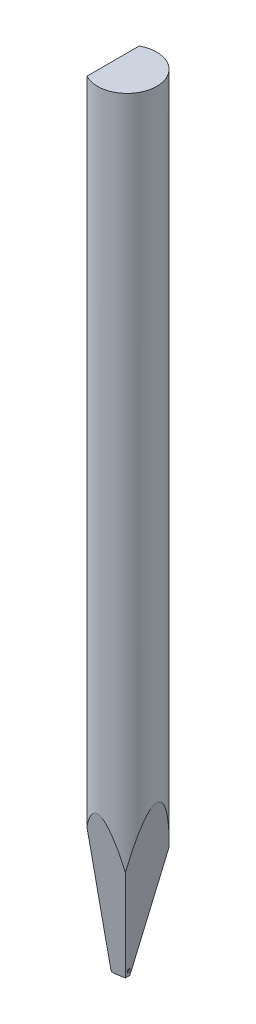
ISO-10303-21;
HEADER;
FILE_DESCRIPTION(('STEP AP214'),'2;1');
FILE_NAME('part.step','',(''),(''),'','','');
FILE_SCHEMA(('AUTOMOTIVE_DESIGN { 1 0 10303 214 1 1 1 1 }'));
ENDSEC;
DATA;
#1=APPLICATION_CONTEXT('core data for automotive mechanical design processes');
#2=APPLICATION_PROTOCOL_DEFINITION('international standard','automotive_design',2000,#1);
#3=PRODUCT_CONTEXT('',#1,'mechanical');
#4=PRODUCT('Part','Part','',(#3));
#5=PRODUCT_RELATED_PRODUCT_CATEGORY('part','',(#4));
#6=PRODUCT_DEFINITION_FORMATION('','',#4);
#7=PRODUCT_DEFINITION_CONTEXT('part definition',#1,'design');
#8=PRODUCT_DEFINITION('design','',#6,#7);
#9=PRODUCT_DEFINITION_SHAPE('','',#8);
#10=(LENGTH_UNIT() NAMED_UNIT(*) SI_UNIT(.MILLI.,.METRE.));
#11=(NAMED_UNIT(*) PLANE_ANGLE_UNIT() SI_UNIT($,.RADIAN.));
#12=(NAMED_UNIT(*) SI_UNIT($,.STERADIAN.) SOLID_ANGLE_UNIT());
#13=UNCERTAINTY_MEASURE_WITH_UNIT(LENGTH_MEASURE(1.E-05),#10,'distance_accuracy_value','');
#14=(GEOMETRIC_REPRESENTATION_CONTEXT(3) GLOBAL_UNCERTAINTY_ASSIGNED_CONTEXT((#13)) GLOBAL_UNIT_ASSIGNED_CONTEXT((#10,
#11,#12)) REPRESENTATION_CONTEXT('',''));
#15=CARTESIAN_POINT('',(0.,0.,0.));
#16=DIRECTION('',(0.,0.,1.));
#17=DIRECTION('',(1.,0.,0.));
#18=AXIS2_PLACEMENT_3D('',#15,#16,#17);
#19=CARTESIAN_POINT('',(26.8738719491216,0.,0.0508));
#20=DIRECTION('',(0.,-0.173648177666931,0.984807753012208));
#21=DIRECTION('',(0.,-0.984807753012208,-0.173648177666931));
#22=AXIS2_PLACEMENT_3D('',#19,#20,#21);
#23=PLANE('',#22);
#24=CARTESIAN_POINT('',(-0.3480816,0.02794,0.0557265758409954));
#25=DIRECTION('',(0.,-0.173648177666931,0.984807753012208));
#26=DIRECTION('',(0.,-0.984807753012208,-0.173648177666931));
#27=AXIS2_PLACEMENT_3D('',#24,#25,#26);
#28=ELLIPSE('',#27,0.0283710195360877,0.02794);
#29=CARTESIAN_POINT('',(-0.3480816,0.,0.0508000000000009));
#30=VERTEX_POINT('',#29);
#31=CARTESIAN_POINT('',(-0.37592,0.0255594358987837,0.0553068181606436));
#32=VERTEX_POINT('',#31);
#33=EDGE_CURVE('E369',#30,#32,#28,.F.);
#34=ORIENTED_EDGE('',*,*,#33,.F.);
#35=DIRECTION('',(-1.,0.,0.));
#36=VECTOR('',#35,1.);
#37=CARTESIAN_POINT('',(26.8738719491216,0.,0.0508));
#38=LINE('',#37,#36);
#39=CARTESIAN_POINT('',(-0.269240000000009,0.,0.0508));
#40=VERTEX_POINT('',#39);
#41=EDGE_CURVE('E390',#40,#30,#38,.T.);
#42=ORIENTED_EDGE('',*,*,#41,.F.);
#43=DIRECTION('',(-0.984346441568213,-0.173566836012845,-0.0306045161452665));
#44=VECTOR('',#43,1.);
#45=CARTESIAN_POINT('',(26.0307503536398,4.63739789171909,0.868498368590632));
#46=LINE('',#45,#44);
#47=CARTESIAN_POINT('',(0.013882623272799,0.0499221573319521,0.0596026232727962));
#48=VERTEX_POINT('',#47);
#49=EDGE_CURVE('E395',#48,#40,#46,.T.);
#50=ORIENTED_EDGE('',*,*,#49,.F.);
#51=DIRECTION('',(-0.171087869746036,-0.970287525247814,-0.171087869746036));
#52=VECTOR('',#51,1.);
#53=CARTESIAN_POINT('',(0.791557999082992,4.46033837772866,0.837277999082991));
#54=LINE('',#53,#52);
#55=CARTESIAN_POINT('',(0.537041505266774,3.0169036135559,0.582761505266773));
#56=VERTEX_POINT('',#55);
#57=EDGE_CURVE('E413',#56,#48,#54,.T.);
#58=ORIENTED_EDGE('',*,*,#57,.F.);
#59=CARTESIAN_POINT('',(0.,-0.288101116436578,0.));
#60=DIRECTION('',(0.,-0.173648177666931,0.984807753012208));
#61=DIRECTION('',(0.,-0.984807753012208,-0.173648177666931));
#62=AXIS2_PLACEMENT_3D('',#59,#60,#61);
#63=ELLIPSE('',#62,4.56371043248163,0.792479999999998);
#64=CARTESIAN_POINT('',(-0.37592,3.66844093071415,0.69764511322018));
#65=VERTEX_POINT('',#64);
#66=EDGE_CURVE('E389',#56,#65,#63,.T.);
#67=ORIENTED_EDGE('',*,*,#66,.T.);
#68=DIRECTION('',(0.,0.984807753012208,0.173648177666931));
#69=VECTOR('',#68,1.);
#70=CARTESIAN_POINT('',(-0.37592,20.251112252608,3.62161747949059));
#71=LINE('',#70,#69);
#72=EDGE_CURVE('E54',#32,#65,#71,.T.);
#73=ORIENTED_EDGE('',*,*,#72,.F.);
#74=EDGE_LOOP('',(#34,#42,#50,#58,#67,#73));
#75=FACE_BOUND('',#74,.T.);
#76=ADVANCED_FACE('F46',(#75),#23,.T.);
#77=CARTESIAN_POINT('',(26.8738719491216,0.,-0.0508));
#78=DIRECTION('',(0.,-0.173648177666931,-0.984807753012208));
#79=DIRECTION('',(0.,0.984807753012208,-0.173648177666931));
#80=AXIS2_PLACEMENT_3D('',#77,#78,#79);
#81=PLANE('',#80);
#82=CARTESIAN_POINT('',(-0.3480816,0.02794,-0.0557265758409954));
#83=DIRECTION('',(0.,-0.173648177666931,-0.984807753012208));
#84=DIRECTION('',(0.,0.984807753012208,-0.173648177666931));
#85=AXIS2_PLACEMENT_3D('',#82,#83,#84);
#86=ELLIPSE('',#85,0.0283710195360877,0.02794);
#87=CARTESIAN_POINT('',(-0.37592,0.0255594358987803,-0.055306818160644));
#88=VERTEX_POINT('',#87);
#89=CARTESIAN_POINT('',(-0.3480816,0.,-0.0508000000000009));
#90=VERTEX_POINT('',#89);
#91=EDGE_CURVE('E374',#88,#90,#86,.F.);
#92=ORIENTED_EDGE('',*,*,#91,.F.);
#93=DIRECTION('',(0.,-0.984807753012208,0.173648177666931));
#94=VECTOR('',#93,1.);
#95=CARTESIAN_POINT('',(-0.37592,20.5255765703836,-3.67001294395617));
#96=LINE('',#95,#94);
#97=CARTESIAN_POINT('',(-0.37592,3.66844093071414,-0.69764511322018));
#98=VERTEX_POINT('',#97);
#99=EDGE_CURVE('E200',#98,#88,#96,.T.);
#100=ORIENTED_EDGE('',*,*,#99,.F.);
#101=CARTESIAN_POINT('',(0.,-0.288101116436578,0.));
#102=DIRECTION('',(0.,-0.173648177666931,-0.984807753012208));
#103=DIRECTION('',(0.,-0.984807753012208,0.173648177666931));
#104=AXIS2_PLACEMENT_3D('',#101,#102,#103);
#105=ELLIPSE('',#104,4.56371043248163,0.792479999999998);
#106=CARTESIAN_POINT('',(0.537041505266774,3.0169036135559,-0.582761505266773));
#107=VERTEX_POINT('',#106);
#108=EDGE_CURVE('E393',#98,#107,#105,.T.);
#109=ORIENTED_EDGE('',*,*,#108,.T.);
#110=DIRECTION('',(0.171087869746036,0.970287525247814,-0.171087869746036));
#111=VECTOR('',#110,1.);
#112=CARTESIAN_POINT('',(0.791557999082992,4.46033837772866,-0.837277999082991));
#113=LINE('',#112,#111);
#114=CARTESIAN_POINT('',(0.013882623272799,0.0499221573319521,-0.0596026232727962));
#115=VERTEX_POINT('',#114);
#116=EDGE_CURVE('E238',#115,#107,#113,.T.);
#117=ORIENTED_EDGE('',*,*,#116,.F.);
#118=DIRECTION('',(0.984346441568213,0.173566836012845,-0.0306045161452665));
#119=VECTOR('',#118,1.);
#120=CARTESIAN_POINT('',(26.0307503536398,4.63739789171909,-0.868498368590632));
#121=LINE('',#120,#119);
#122=CARTESIAN_POINT('',(-0.269240000000009,0.,-0.0508));
#123=VERTEX_POINT('',#122);
#124=EDGE_CURVE('E245',#123,#115,#121,.T.);
#125=ORIENTED_EDGE('',*,*,#124,.F.);
#126=DIRECTION('',(-1.,0.,0.));
#127=VECTOR('',#126,1.);
#128=CARTESIAN_POINT('',(26.8738719491216,0.,-0.0508));
#129=LINE('',#128,#127);
#130=EDGE_CURVE('E386',#123,#90,#129,.T.);
#131=ORIENTED_EDGE('',*,*,#130,.T.);
#132=EDGE_LOOP('',(#92,#100,#109,#117,#125,#131));
#133=FACE_BOUND('',#132,.T.);
#134=ADVANCED_FACE('F317',(#133),#81,.T.);
#135=CARTESIAN_POINT('',(-0.29337,0.,0.0254));
#136=DIRECTION('',(0.866025403784436,-0.500000000000004,0.));
#137=DIRECTION('',(0.500000000000004,0.866025403784436,0.));
#138=AXIS2_PLACEMENT_3D('',#135,#136,#137);
#139=PLANE('',#138);
#140=DIRECTION('',(0.,0.,1.));
#141=VECTOR('',#140,1.);
#142=CARTESIAN_POINT('',(-0.288032486856643,0.0092448439503614,-0.00635));
#143=LINE('',#142,#141);
#144=CARTESIAN_POINT('',(-0.288032486856643,0.0092448439503614,-0.00635));
#145=VERTEX_POINT('',#144);
#146=CARTESIAN_POINT('',(-0.288032486856643,0.0092448439503614,0.00635));
#147=VERTEX_POINT('',#146);
#148=EDGE_CURVE('E685',#145,#147,#143,.T.);
#149=ORIENTED_EDGE('',*,*,#148,.F.);
#150=DIRECTION('',(-0.500000000000004,-0.866025403784436,0.));
#151=VECTOR('',#150,1.);
#152=CARTESIAN_POINT('',(-0.29337,0.,-0.00635));
#153=LINE('',#152,#151);
#154=CARTESIAN_POINT('',(-0.291657824144469,0.00296557557327858,-0.00635));
#155=VERTEX_POINT('',#154);
#156=EDGE_CURVE('E680',#145,#155,#153,.T.);
#157=ORIENTED_EDGE('',*,*,#156,.T.);
#158=CARTESIAN_POINT('',(-0.429457213475478,-0.235709968,0.));
#159=DIRECTION('',(0.866025403784436,-0.500000000000004,0.));
#160=DIRECTION('',(-0.500000000000004,-0.866025403784436,0.));
#161=AXIS2_PLACEMENT_3D('',#158,#159,#160);
#162=ELLIPSE('',#161,0.275696300543431,0.23876);
#163=CARTESIAN_POINT('',(-0.29239131983304,0.00169512377353462,-0.0254));
#164=VERTEX_POINT('',#163);
#165=EDGE_CURVE('E262',#164,#155,#162,.T.);
#166=ORIENTED_EDGE('',*,*,#165,.F.);
#167=DIRECTION('',(-0.500000000000004,-0.866025403784436,0.));
#168=VECTOR('',#167,1.);
#169=CARTESIAN_POINT('',(-0.29337,0.,-0.0254));
#170=LINE('',#169,#168);
#171=CARTESIAN_POINT('',(-0.239110621701558,0.0939800000000001,-0.0254));
#172=VERTEX_POINT('',#171);
#173=EDGE_CURVE('E651',#172,#164,#170,.T.);
#174=ORIENTED_EDGE('',*,*,#173,.F.);
#175=DIRECTION('',(0.,0.,-1.));
#176=VECTOR('',#175,1.);
#177=CARTESIAN_POINT('',(-0.239110621701558,0.0939800000000001,0.0254));
#178=LINE('',#177,#176);
#179=CARTESIAN_POINT('',(-0.239110621701558,0.0939800000000001,0.0254));
#180=VERTEX_POINT('',#179);
#181=EDGE_CURVE('E253',#180,#172,#178,.T.);
#182=ORIENTED_EDGE('',*,*,#181,.F.);
#183=DIRECTION('',(-0.500000000000004,-0.866025403784436,0.));
#184=VECTOR('',#183,1.);
#185=CARTESIAN_POINT('',(-0.29337,0.,0.0254));
#186=LINE('',#185,#184);
#187=CARTESIAN_POINT('',(-0.29239131983304,0.00169512377353462,0.0254));
#188=VERTEX_POINT('',#187);
#189=EDGE_CURVE('E659',#180,#188,#186,.T.);
#190=ORIENTED_EDGE('',*,*,#189,.T.);
#191=CARTESIAN_POINT('',(-0.291657824144469,0.00296557557327858,0.00635));
#192=VERTEX_POINT('',#191);
#193=EDGE_CURVE('E261',#192,#188,#162,.T.);
#194=ORIENTED_EDGE('',*,*,#193,.F.);
#195=DIRECTION('',(-0.500000000000004,-0.866025403784436,0.));
#196=VECTOR('',#195,1.);
#197=CARTESIAN_POINT('',(-0.29337,0.,0.00635));
#198=LINE('',#197,#196);
#199=EDGE_CURVE('E683',#147,#192,#198,.T.);
#200=ORIENTED_EDGE('',*,*,#199,.F.);
#201=EDGE_LOOP('',(#149,#157,#166,#174,#182,#190,#194,#200));
#202=FACE_BOUND('',#201,.T.);
#203=ADVANCED_FACE('F290',(#202),#139,.T.);
#204=CARTESIAN_POINT('',(26.7405219491216,-0.235709968,0.));
#205=DIRECTION('',(-1.,0.,0.));
#206=DIRECTION('',(0.,0.,1.));
#207=AXIS2_PLACEMENT_3D('',#204,#205,#206);
#208=CYLINDRICAL_SURFACE('',#207,0.23876);
#209=DIRECTION('',(-1.,0.,0.));
#210=VECTOR('',#209,1.);
#211=CARTESIAN_POINT('',(26.7405219491216,0.,0.0380414061969188));
#212=LINE('',#211,#210);
#213=CARTESIAN_POINT('',(-0.26924,0.,0.0380414061969224));
#214=VERTEX_POINT('',#213);
#215=CARTESIAN_POINT('',(-0.348081600000001,0.,0.0380414061969189));
#216=VERTEX_POINT('',#215);
#217=EDGE_CURVE('E276',#214,#216,#212,.T.);
#218=ORIENTED_EDGE('',*,*,#217,.T.);
#219=CARTESIAN_POINT('',(-0.3480816,0.,0.0380414061969188));
#220=CARTESIAN_POINT('',(-0.348370297249881,-1.57473913094452E-07,0.0380422867495793));
#221=CARTESIAN_POINT('',(-0.348657740094899,4.46809397733516E-06,0.0380137267014361));
#222=CARTESIAN_POINT('',(-0.349218887029546,2.18064433425661E-05,0.0379061055838232));
#223=CARTESIAN_POINT('',(-0.349492724840044,3.44083287340178E-05,0.0378277369505647));
#224=CARTESIAN_POINT('',(-0.350087059114706,7.00964341791643E-05,0.0376046986053117));
#225=CARTESIAN_POINT('',(-0.350403088810441,9.49673206046473E-05,0.0374486675593185));
#226=CARTESIAN_POINT('',(-0.351006970235381,0.000151905184797741,0.0370883847614802));
#227=CARTESIAN_POINT('',(-0.351294652771117,0.000184012004650592,0.036883865690612));
#228=CARTESIAN_POINT('',(-0.352028776233906,0.000276294124554952,0.0362899601536919));
#229=CARTESIAN_POINT('',(-0.352449418385566,0.000340660694436656,0.0358697272673334));
#230=CARTESIAN_POINT('',(-0.353225932848081,0.000474891774519048,0.0349751304448968));
#231=CARTESIAN_POINT('',(-0.353581667371428,0.000544767539923122,0.034500654753102));
#232=CARTESIAN_POINT('',(-0.354806983366323,0.000805664825619692,0.0326871096256259));
#233=CARTESIAN_POINT('',(-0.355523812901215,0.00100099119137988,0.0312475495296627));
#234=CARTESIAN_POINT('',(-0.356756481320225,0.00137374562286157,0.0282836130517373));
#235=CARTESIAN_POINT('',(-0.357271067728808,0.00155105726413036,0.0267587729336342));
#236=CARTESIAN_POINT('',(-0.358984388303717,0.00217715184867487,0.0208575211290827));
#237=CARTESIAN_POINT('',(-0.359724634901563,0.00253296209976583,0.0163401332990547));
#238=CARTESIAN_POINT('',(-0.360649680189473,0.00298440192897113,0.00724301122279436));
#239=CARTESIAN_POINT('',(-0.360832500485171,0.00307910468161393,0.00266311272708323));
#240=CARTESIAN_POINT('',(-0.360698041243689,0.00301061173586352,-0.00586876642304038));
#241=CARTESIAN_POINT('',(-0.36044514102484,0.00288060829416939,-0.00982177938728517));
#242=CARTESIAN_POINT('',(-0.359491898998143,0.00242887100320888,-0.0176448861764567));
#243=CARTESIAN_POINT('',(-0.358794873864542,0.0021085595402366,-0.021515376688691));
#244=CARTESIAN_POINT('',(-0.357222430963112,0.00153295180831518,-0.0269242607235509));
#245=CARTESIAN_POINT('',(-0.356664973165378,0.00134153533633056,-0.0285559425380455));
#246=CARTESIAN_POINT('',(-0.355595494923302,0.00102631943173864,-0.0310338022217961));
#247=CARTESIAN_POINT('',(-0.355166851267188,0.000908802026046567,-0.0319162751728795));
#248=CARTESIAN_POINT('',(-0.354198192038508,0.000673078002672362,-0.0336171714865279));
#249=CARTESIAN_POINT('',(-0.353658727146443,0.000554877499001803,-0.0344358849448356));
#250=CARTESIAN_POINT('',(-0.352792473999132,0.000398932412591014,-0.0354826265763768));
#251=CARTESIAN_POINT('',(-0.352535684202114,0.000355948704027794,-0.0357672474222327));
#252=CARTESIAN_POINT('',(-0.351991047696761,0.000273479004891516,-0.0363073571268736));
#253=CARTESIAN_POINT('',(-0.351703144323672,0.000233999642937708,-0.0365627910288029));
#254=CARTESIAN_POINT('',(-0.35108793464418,0.000160455666459456,-0.0370342917065393));
#255=CARTESIAN_POINT('',(-0.350760075059589,0.000126487029396559,-0.0372496686651115));
#256=CARTESIAN_POINT('',(-0.350069414087339,6.86840470784521E-05,-0.0376138150256087));
#257=CARTESIAN_POINT('',(-0.349706859083061,4.47839288315495E-05,-0.0377630170672981));
#258=CARTESIAN_POINT('',(-0.349129320182638,1.8915398594351E-05,-0.0379240631580032));
#259=CARTESIAN_POINT('',(-0.348923259579573,1.19156993312165E-05,-0.0379675207414632));
#260=CARTESIAN_POINT('',(-0.348505477733543,2.41659635047184E-06,-0.03802643348229));
#261=CARTESIAN_POINT('',(-0.348293724939053,-4.74009174678995E-08,-0.0380416683341019));
#262=CARTESIAN_POINT('',(-0.348081600002118,-4.88028125320799E-13,-0.0380414062044368));
#263=B_SPLINE_CURVE_WITH_KNOTS('',3,(#219,#220,#221,#222,#223,#224,#225,#226,#227,#228,#229,
#230,#231,#232,#233,#234,#235,#236,#237,#238,#239,#240,#241,#242,#243,#244,#245,#246,#247,#248,
#249,#250,#251,#252,#253,#254,#255,#256,#257,#258,#259,#260,#261,#262),.UNSPECIFIED.,.F.,.F.,(4,
2,2,2,2,2,2,2,2,2,2,2,2,2,2,2,2,2,2,2,2,4),(0.,0.00086262961666917,0.00171352175331503,
0.00276753746066433,0.00382750502025348,0.00561156625222818,0.00739937175537492,
0.0122218634154351,0.0170737667410356,0.0307525437377263,0.0444798127023014,0.0563478770749282,
0.0681283345815422,0.0733182116250238,0.0762783450561242,0.0792241104656409,0.0803796142217476,
0.081537259050029,0.0827132934559175,0.0838815215489419,0.0845118039055874,0.0851469858208381),.UNSPECIFIED.);
#264=CARTESIAN_POINT('',(-0.358997429580646,0.00222774432347879,0.0197940895484501));
#265=VERTEX_POINT('',#264);
#266=EDGE_CURVE('E366',#216,#265,#263,.T.);
#267=ORIENTED_EDGE('',*,*,#266,.T.);
#268=CARTESIAN_POINT('',(-0.37592,0.,-0.038041406196919));
#269=CARTESIAN_POINT('',(-0.363217112126589,0.00202856108150842,-0.0254721529697044));
#270=CARTESIAN_POINT('',(-0.35052,0.003050032,-0.0127347043389898));
#271=CARTESIAN_POINT('',(-0.35052,0.00305003200000001,0.0127347043389896));
#272=CARTESIAN_POINT('',(-0.363217112126589,0.00202856108150846,0.0254721529697042));
#273=CARTESIAN_POINT('',(-0.37592,0.,0.0380414061969188));
#274=(BOUNDED_CURVE() B_SPLINE_CURVE(3,(#268,#269,#270,#271,#272,#273),.UNSPECIFIED.,.F.,
.F.) B_SPLINE_CURVE_WITH_KNOTS((4,2,4),(1.41078533369424,1.5707963267949,1.73080731989555),
.UNSPECIFIED.) CURVE() GEOMETRIC_REPRESENTATION_ITEM() RATIONAL_B_SPLINE_CURVE((1.,1.,1.,1.,1.,1.)) REPRESENTATION_ITEM(''));
#275=CARTESIAN_POINT('',(-0.358997404420858,0.00222774394011899,-0.0197940941611276));
#276=VERTEX_POINT('',#275);
#277=EDGE_CURVE('E193',#265,#276,#274,.F.);
#278=ORIENTED_EDGE('',*,*,#277,.T.);
#279=CARTESIAN_POINT('',(-0.348081600000001,0.,-0.0380414061969189));
#280=VERTEX_POINT('',#279);
#281=EDGE_CURVE('E76',#276,#280,#263,.T.);
#282=ORIENTED_EDGE('',*,*,#281,.T.);
#283=DIRECTION('',(-1.,0.,0.));
#284=VECTOR('',#283,1.);
#285=CARTESIAN_POINT('',(26.7405219491216,0.,-0.0380414061969189));
#286=LINE('',#285,#284);
#287=CARTESIAN_POINT('',(-0.26924,0.,-0.0380414061969224));
#288=VERTEX_POINT('',#287);
#289=EDGE_CURVE('E387',#288,#280,#286,.T.);
#290=ORIENTED_EDGE('',*,*,#289,.F.);
#291=CARTESIAN_POINT('',(-1.60601765622106,-0.235709968,0.));
#292=DIRECTION('',(-0.173648177666931,0.984807753012208,0.));
#293=DIRECTION('',(-0.984807753012208,-0.173648177666931,0.));
#294=AXIS2_PLACEMENT_3D('',#291,#292,#293);
#295=ELLIPSE('',#294,1.37496404055537,0.23876);
#296=CARTESIAN_POINT('',(-0.259626475361104,0.00169512377353837,-0.0253999999999992));
#297=VERTEX_POINT('',#296);
#298=EDGE_CURVE('E673',#297,#288,#295,.T.);
#299=ORIENTED_EDGE('',*,*,#298,.F.);
#300=DIRECTION('',(-1.,0.,0.));
#301=VECTOR('',#300,1.);
#302=CARTESIAN_POINT('',(26.7405219491216,0.00169512377353378,-0.0254));
#303=LINE('',#302,#301);
#304=EDGE_CURVE('E678',#164,#297,#303,.F.);
#305=ORIENTED_EDGE('',*,*,#304,.F.);
#306=ORIENTED_EDGE('',*,*,#165,.T.);
#307=DIRECTION('',(-1.,0.,0.));
#308=VECTOR('',#307,1.);
#309=CARTESIAN_POINT('',(26.7405219491216,0.00296557557327858,-0.00635));
#310=LINE('',#309,#308);
#311=CARTESIAN_POINT('',(-0.305284634933386,0.00296557557327635,-0.00635));
#312=VERTEX_POINT('',#311);
#313=EDGE_CURVE('E271',#312,#155,#310,.F.);
#314=ORIENTED_EDGE('',*,*,#313,.F.);
#315=CARTESIAN_POINT('',(-0.961040301477024,-0.235709968,0.));
#316=DIRECTION('',(-0.342020143325664,0.93969262078591,0.));
#317=DIRECTION('',(-0.93969262078591,-0.342020143325664,0.));
#318=AXIS2_PLACEMENT_3D('',#315,#316,#317);
#319=ELLIPSE('',#318,0.698087538582949,0.23876);
#320=CARTESIAN_POINT('',(-0.305284634933386,0.00296557557327635,0.00635));
#321=VERTEX_POINT('',#320);
#322=EDGE_CURVE('E268',#312,#321,#319,.F.);
#323=ORIENTED_EDGE('',*,*,#322,.T.);
#324=DIRECTION('',(-1.,0.,0.));
#325=VECTOR('',#324,1.);
#326=CARTESIAN_POINT('',(26.7405219491216,0.00296557557327858,0.00635));
#327=LINE('',#326,#325);
#328=EDGE_CURVE('E265',#321,#192,#327,.F.);
#329=ORIENTED_EDGE('',*,*,#328,.T.);
#330=ORIENTED_EDGE('',*,*,#193,.T.);
#331=DIRECTION('',(-1.,0.,0.));
#332=VECTOR('',#331,1.);
#333=CARTESIAN_POINT('',(26.7405219491216,0.00169512377353378,0.0254));
#334=LINE('',#333,#332);
#335=CARTESIAN_POINT('',(-0.259626475361104,0.00169512377353837,0.0253999999999992));
#336=VERTEX_POINT('',#335);
#337=EDGE_CURVE('E675',#188,#336,#334,.F.);
#338=ORIENTED_EDGE('',*,*,#337,.T.);
#339=EDGE_CURVE('E672',#214,#336,#295,.T.);
#340=ORIENTED_EDGE('',*,*,#339,.F.);
#341=EDGE_LOOP('',(#218,#267,#278,#282,#290,#299,#305,#306,#314,#323,#329,#330,#338,#340));
#342=FACE_BOUND('',#341,.T.);
#343=ADVANCED_FACE('F279',(#342),#208,.F.);
#344=CARTESIAN_POINT('',(0.,0.,0.));
#345=DIRECTION('',(0.,1.,0.));
#346=DIRECTION('',(0.,0.,1.));
#347=AXIS2_PLACEMENT_3D('',#344,#345,#346);
#348=PLANE('',#347);
#349=ORIENTED_EDGE('',*,*,#41,.T.);
#350=DIRECTION('',(0.,0.,-1.));
#351=VECTOR('',#350,1.);
#352=CARTESIAN_POINT('',(-0.3480816,0.,26.4184786070088));
#353=LINE('',#352,#351);
#354=EDGE_CURVE('E68',#30,#216,#353,.T.);
#355=ORIENTED_EDGE('',*,*,#354,.T.);
#356=ORIENTED_EDGE('',*,*,#217,.F.);
#357=DIRECTION('',(0.,0.,-1.));
#358=VECTOR('',#357,1.);
#359=CARTESIAN_POINT('',(-0.26924,0.,27.2760283406468));
#360=LINE('',#359,#358);
#361=EDGE_CURVE('E634',#40,#214,#360,.T.);
#362=ORIENTED_EDGE('',*,*,#361,.F.);
#363=EDGE_LOOP('',(#349,#355,#356,#362));
#364=FACE_BOUND('',#363,.T.);
#365=ADVANCED_FACE('F289',(#364),#348,.F.);
#366=ORIENTED_EDGE('',*,*,#289,.T.);
#367=EDGE_CURVE('E381',#280,#90,#353,.T.);
#368=ORIENTED_EDGE('',*,*,#367,.T.);
#369=ORIENTED_EDGE('',*,*,#130,.F.);
#370=EDGE_CURVE('E643',#288,#123,#360,.T.);
#371=ORIENTED_EDGE('',*,*,#370,.F.);
#372=EDGE_LOOP('',(#366,#368,#369,#371));
#373=FACE_BOUND('',#372,.T.);
#374=ADVANCED_FACE('F330',(#373),#348,.F.);
#375=CARTESIAN_POINT('',(-0.26924,0.,27.2760283406468));
#376=DIRECTION('',(-0.173648177666931,0.984807753012208,0.));
#377=DIRECTION('',(-0.984807753012208,-0.173648177666931,0.));
#378=AXIS2_PLACEMENT_3D('',#375,#376,#377);
#379=PLANE('',#378);
#380=ORIENTED_EDGE('',*,*,#361,.T.);
#381=ORIENTED_EDGE('',*,*,#339,.T.);
#382=DIRECTION('',(-0.984807753012208,-0.173648177666931,0.));
#383=VECTOR('',#382,1.);
#384=CARTESIAN_POINT('',(-0.26924,0.,0.0253999999999983));
#385=LINE('',#384,#383);
#386=CARTESIAN_POINT('',(-0.12065,0.026200426063471,0.0253999999999992));
#387=VERTEX_POINT('',#386);
#388=EDGE_CURVE('E258',#387,#336,#385,.T.);
#389=ORIENTED_EDGE('',*,*,#388,.F.);
#390=DIRECTION('',(0.,0.,1.));
#391=VECTOR('',#390,1.);
#392=CARTESIAN_POINT('',(-0.12065,0.0262004260634709,27.2760283406468));
#393=LINE('',#392,#391);
#394=CARTESIAN_POINT('',(-0.12065,0.026200426063471,-0.0253999999999992));
#395=VERTEX_POINT('',#394);
#396=EDGE_CURVE('E256',#395,#387,#393,.T.);
#397=ORIENTED_EDGE('',*,*,#396,.F.);
#398=DIRECTION('',(-0.984807753012208,-0.173648177666931,0.));
#399=VECTOR('',#398,1.);
#400=CARTESIAN_POINT('',(-0.26924,0.,-0.0253999999999983));
#401=LINE('',#400,#399);
#402=EDGE_CURVE('E248',#395,#297,#401,.T.);
#403=ORIENTED_EDGE('',*,*,#402,.T.);
#404=ORIENTED_EDGE('',*,*,#298,.T.);
#405=ORIENTED_EDGE('',*,*,#370,.T.);
#406=ORIENTED_EDGE('',*,*,#124,.T.);
#407=DIRECTION('',(0.,0.,-1.));
#408=VECTOR('',#407,1.);
#409=CARTESIAN_POINT('',(0.0138826232727961,0.0499221573319526,27.2760283406468));
#410=LINE('',#409,#408);
#411=EDGE_CURVE('E252',#48,#115,#410,.T.);
#412=ORIENTED_EDGE('',*,*,#411,.F.);
#413=ORIENTED_EDGE('',*,*,#49,.T.);
#414=EDGE_LOOP('',(#380,#381,#389,#397,#403,#404,#405,#406,#412,#413));
#415=FACE_BOUND('',#414,.T.);
#416=ADVANCED_FACE('F326',(#415),#379,.F.);
#417=CARTESIAN_POINT('',(0.,21.0312,0.));
#418=DIRECTION('',(0.,-1.,0.));
#419=DIRECTION('',(0.,0.,-1.));
#420=AXIS2_PLACEMENT_3D('',#417,#418,#419);
#421=CYLINDRICAL_SURFACE('',#420,0.792479999999998);
#422=ORIENTED_EDGE('',*,*,#66,.F.);
#423=CARTESIAN_POINT('',(0.,-0.0288101116436568,0.));
#424=DIRECTION('',(-0.984807753012208,0.173648177666931,0.));
#425=DIRECTION('',(-0.173648177666931,-0.984807753012208,0.));
#426=AXIS2_PLACEMENT_3D('',#423,#424,#425);
#427=ELLIPSE('',#426,4.56371043248164,0.792479999999998);
#428=EDGE_CURVE('E638',#56,#107,#427,.T.);
#429=ORIENTED_EDGE('',*,*,#428,.T.);
#430=ORIENTED_EDGE('',*,*,#108,.F.);
#431=DIRECTION('',(0.,-1.,0.));
#432=VECTOR('',#431,1.);
#433=CARTESIAN_POINT('',(-0.37592,21.0312,-0.69764511322018));
#434=LINE('',#433,#432);
#435=CARTESIAN_POINT('',(-0.37592,21.0312,-0.69764511322018));
#436=VERTEX_POINT('',#435);
#437=EDGE_CURVE('E404',#436,#98,#434,.T.);
#438=ORIENTED_EDGE('',*,*,#437,.F.);
#439=CARTESIAN_POINT('',(0.,21.0312,0.));
#440=DIRECTION('',(0.,1.,0.));
#441=DIRECTION('',(0.,0.,1.));
#442=AXIS2_PLACEMENT_3D('',#439,#440,#441);
#443=CIRCLE('',#442,0.792479999999998);
#444=CARTESIAN_POINT('',(-0.37592,21.0312,0.69764511322018));
#445=VERTEX_POINT('',#444);
#446=EDGE_CURVE('E405',#445,#436,#443,.T.);
#447=ORIENTED_EDGE('',*,*,#446,.F.);
#448=DIRECTION('',(0.,-1.,0.));
#449=VECTOR('',#448,1.);
#450=CARTESIAN_POINT('',(-0.37592,21.0312,0.69764511322018));
#451=LINE('',#450,#449);
#452=EDGE_CURVE('E402',#65,#445,#451,.F.);
#453=ORIENTED_EDGE('',*,*,#452,.F.);
#454=EDGE_LOOP('',(#422,#429,#430,#438,#447,#453));
#455=FACE_BOUND('',#454,.T.);
#456=ADVANCED_FACE('F329',(#455),#421,.T.);
#457=CARTESIAN_POINT('',(-0.37592,21.0312,-0.80247998));
#458=DIRECTION('',(-1.,0.,0.));
#459=DIRECTION('',(0.,0.,1.));
#460=AXIS2_PLACEMENT_3D('',#457,#458,#459);
#461=PLANE('',#460);
#462=CARTESIAN_POINT('',(-0.37592,0.,0.0380414061969188));
#463=CARTESIAN_POINT('',(-0.37592,0.0144525311347559,0.0275806498206756));
#464=CARTESIAN_POINT('',(-0.37592,0.0284500319999992,0.0140880799781967));
#465=CARTESIAN_POINT('',(-0.37592,0.0284500319999992,-0.014088079978197));
#466=CARTESIAN_POINT('',(-0.37592,0.0144525311347538,-0.0275806498206756));
#467=CARTESIAN_POINT('',(-0.37592,0.,-0.038041406196919));
#468=(BOUNDED_CURVE() B_SPLINE_CURVE(3,(#462,#463,#464,#465,#466,#467),.UNSPECIFIED.,.F.,
.F.) B_SPLINE_CURVE_WITH_KNOTS((4,2,4),(1.41078533369424,1.5707963267949,1.73080731989555),
.UNSPECIFIED.) CURVE() GEOMETRIC_REPRESENTATION_ITEM() RATIONAL_B_SPLINE_CURVE((1.,1.,1.,1.,1.,1.)) REPRESENTATION_ITEM(''));
#469=CARTESIAN_POINT('',(-0.375920000000905,0.025559646452318,-0.0113540778486098));
#470=VERTEX_POINT('',#469);
#471=CARTESIAN_POINT('',(-0.375920000000232,0.025559671908067,0.011507681188645));
#472=VERTEX_POINT('',#471);
#473=EDGE_CURVE('E186',#470,#472,#468,.F.);
#474=ORIENTED_EDGE('',*,*,#473,.T.);
#475=DIRECTION('',(0.,0.,-1.));
#476=VECTOR('',#475,1.);
#477=CARTESIAN_POINT('',(-0.37592,0.0255594358987817,26.4184786070088));
#478=LINE('',#477,#476);
#479=EDGE_CURVE('E370',#32,#472,#478,.T.);
#480=ORIENTED_EDGE('',*,*,#479,.F.);
#481=ORIENTED_EDGE('',*,*,#72,.T.);
#482=ORIENTED_EDGE('',*,*,#452,.T.);
#483=DIRECTION('',(0.,0.,-1.));
#484=VECTOR('',#483,1.);
#485=CARTESIAN_POINT('',(-0.37592,21.0312,-0.80247998));
#486=LINE('',#485,#484);
#487=EDGE_CURVE('E400',#445,#436,#486,.T.);
#488=ORIENTED_EDGE('',*,*,#487,.T.);
#489=ORIENTED_EDGE('',*,*,#437,.T.);
#490=ORIENTED_EDGE('',*,*,#99,.T.);
#491=EDGE_CURVE('E197',#470,#88,#478,.T.);
#492=ORIENTED_EDGE('',*,*,#491,.F.);
#493=EDGE_LOOP('',(#474,#480,#481,#482,#488,#489,#490,#492));
#494=FACE_BOUND('',#493,.T.);
#495=ADVANCED_FACE('F198',(#494),#461,.T.);
#496=CARTESIAN_POINT('',(0.,21.0312,0.));
#497=DIRECTION('',(0.,1.,0.));
#498=DIRECTION('',(0.,0.,1.));
#499=AXIS2_PLACEMENT_3D('',#496,#497,#498);
#500=PLANE('',#499);
#501=ORIENTED_EDGE('',*,*,#446,.T.);
#502=ORIENTED_EDGE('',*,*,#487,.F.);
#503=EDGE_LOOP('',(#501,#502));
#504=FACE_BOUND('',#503,.T.);
#505=ADVANCED_FACE('F324',(#504),#500,.T.);
#506=CARTESIAN_POINT('',(0.0138826232727961,0.0499221573319526,27.2760283406468));
#507=DIRECTION('',(-0.984807753012208,0.173648177666931,0.));
#508=DIRECTION('',(-0.173648177666931,-0.984807753012208,0.));
#509=AXIS2_PLACEMENT_3D('',#506,#507,#508);
#510=PLANE('',#509);
#511=CARTESIAN_POINT('',(0.0408608715396788,0.202923406253057,0.));
#512=DIRECTION('',(-0.984807753012208,0.173648177666931,0.));
#513=DIRECTION('',(0.173648177666931,0.984807753012208,0.));
#514=AXIS2_PLACEMENT_3D('',#511,#512,#513);
#515=ELLIPSE('',#514,0.0510507152050236,0.0366689973897192);
#516=CARTESIAN_POINT('',(0.0497257352036246,0.253198546383783,0.));
#517=VERTEX_POINT('',#516);
#518=EDGE_CURVE('E249',#517,#517,#515,.F.);
#519=ORIENTED_EDGE('',*,*,#518,.F.);
#520=EDGE_LOOP('',(#519));
#521=FACE_BOUND('',#520,.T.);
#522=ORIENTED_EDGE('',*,*,#428,.F.);
#523=ORIENTED_EDGE('',*,*,#57,.T.);
#524=ORIENTED_EDGE('',*,*,#411,.T.);
#525=ORIENTED_EDGE('',*,*,#116,.T.);
#526=EDGE_LOOP('',(#522,#523,#524,#525));
#527=FACE_BOUND('',#526,.T.);
#528=ADVANCED_FACE('F313',(#521,#527),#510,.F.);
#529=CARTESIAN_POINT('',(-0.12065,0.0939800000000001,0.0254));
#530=DIRECTION('',(-1.,0.,0.));
#531=DIRECTION('',(0.,0.,1.));
#532=AXIS2_PLACEMENT_3D('',#529,#530,#531);
#533=PLANE('',#532);
#534=ORIENTED_EDGE('',*,*,#396,.T.);
#535=DIRECTION('',(0.,1.,0.));
#536=VECTOR('',#535,1.);
#537=CARTESIAN_POINT('',(-0.12065,0.0939800000000001,0.0254));
#538=LINE('',#537,#536);
#539=CARTESIAN_POINT('',(-0.12065,0.0939800000000001,0.0254));
#540=VERTEX_POINT('',#539);
#541=EDGE_CURVE('E647',#387,#540,#538,.T.);
#542=ORIENTED_EDGE('',*,*,#541,.T.);
#543=CARTESIAN_POINT('',(-0.12065,0.09398,0.));
#544=DIRECTION('',(1.,0.,0.));
#545=DIRECTION('',(0.,1.,0.));
#546=AXIS2_PLACEMENT_3D('',#543,#544,#545);
#547=ELLIPSE('',#546,0.0293293936748329,0.0254);
#548=CARTESIAN_POINT('',(-0.12065,0.0939800000000001,-0.0253999999999983));
#549=VERTEX_POINT('',#548);
#550=EDGE_CURVE('E657',#549,#540,#547,.F.);
#551=ORIENTED_EDGE('',*,*,#550,.F.);
#552=DIRECTION('',(0.,1.,0.));
#553=VECTOR('',#552,1.);
#554=CARTESIAN_POINT('',(-0.12065,0.0939800000000001,-0.0254));
#555=LINE('',#554,#553);
#556=EDGE_CURVE('E648',#395,#549,#555,.T.);
#557=ORIENTED_EDGE('',*,*,#556,.F.);
#558=EDGE_LOOP('',(#534,#542,#551,#557));
#559=FACE_BOUND('',#558,.T.);
#560=ADVANCED_FACE('F306',(#559),#533,.T.);
#561=CARTESIAN_POINT('',(0.,0.,0.0254));
#562=DIRECTION('',(0.,0.,-1.));
#563=DIRECTION('',(-1.,0.,0.));
#564=AXIS2_PLACEMENT_3D('',#561,#562,#563);
#565=PLANE('',#564);
#566=ORIENTED_EDGE('',*,*,#337,.F.);
#567=ORIENTED_EDGE('',*,*,#189,.F.);
#568=DIRECTION('',(-1.,0.,0.));
#569=VECTOR('',#568,1.);
#570=CARTESIAN_POINT('',(-0.239110621701558,0.0939800000000001,0.0254));
#571=LINE('',#570,#569);
#572=EDGE_CURVE('E650',#540,#180,#571,.T.);
#573=ORIENTED_EDGE('',*,*,#572,.F.);
#574=ORIENTED_EDGE('',*,*,#541,.F.);
#575=ORIENTED_EDGE('',*,*,#388,.T.);
#576=EDGE_LOOP('',(#566,#567,#573,#574,#575));
#577=FACE_BOUND('',#576,.T.);
#578=ADVANCED_FACE('F303',(#577),#565,.T.);
#579=CARTESIAN_POINT('',(0.,0.,-0.0254));
#580=DIRECTION('',(0.,0.,-1.));
#581=DIRECTION('',(-1.,0.,0.));
#582=AXIS2_PLACEMENT_3D('',#579,#580,#581);
#583=PLANE('',#582);
#584=ORIENTED_EDGE('',*,*,#173,.T.);
#585=ORIENTED_EDGE('',*,*,#304,.T.);
#586=ORIENTED_EDGE('',*,*,#402,.F.);
#587=ORIENTED_EDGE('',*,*,#556,.T.);
#588=DIRECTION('',(-1.,0.,0.));
#589=VECTOR('',#588,1.);
#590=CARTESIAN_POINT('',(-0.239110621701558,0.0939800000000001,-0.0254));
#591=LINE('',#590,#589);
#592=EDGE_CURVE('E654',#549,#172,#591,.T.);
#593=ORIENTED_EDGE('',*,*,#592,.T.);
#594=EDGE_LOOP('',(#584,#585,#586,#587,#593));
#595=FACE_BOUND('',#594,.T.);
#596=ADVANCED_FACE('F297',(#595),#583,.F.);
#597=CARTESIAN_POINT('',(0.0189986001948874,0.174606156914472,0.));
#598=DIRECTION('',(0.866025403784441,0.499999999999995,0.));
#599=DIRECTION('',(-0.499999999999995,0.866025403784441,0.));
#600=AXIS2_PLACEMENT_3D('',#597,#598,#599);
#601=CONICAL_SURFACE('',#600,0.0254,0.392699081698725);
#602=CARTESIAN_POINT('',(0.0189986001948874,0.174606156914472,0.));
#603=DIRECTION('',(0.866025403784441,0.499999999999995,0.));
#604=DIRECTION('',(-0.499999999999995,0.866025403784441,0.));
#605=AXIS2_PLACEMENT_3D('',#602,#603,#604);
#606=CIRCLE('',#605,0.0254);
#607=CARTESIAN_POINT('',(0.00629860019488755,0.196603202170597,0.));
#608=VERTEX_POINT('',#607);
#609=EDGE_CURVE('E669',#608,#608,#606,.T.);
#610=ORIENTED_EDGE('',*,*,#609,.F.);
#611=EDGE_LOOP('',(#610));
#612=FACE_BOUND('',#611,.T.);
#613=ORIENTED_EDGE('',*,*,#518,.T.);
#614=EDGE_LOOP('',(#613));
#615=FACE_BOUND('',#614,.T.);
#616=ADVANCED_FACE('F292',(#612,#615),#601,.F.);
#617=CARTESIAN_POINT('',(-0.239110621701558,0.0939800000000001,0.0254));
#618=DIRECTION('',(0.,-1.,0.));
#619=DIRECTION('',(0.,0.,-1.));
#620=AXIS2_PLACEMENT_3D('',#617,#618,#619);
#621=PLANE('',#620);
#622=ORIENTED_EDGE('',*,*,#572,.T.);
#623=ORIENTED_EDGE('',*,*,#181,.T.);
#624=ORIENTED_EDGE('',*,*,#592,.F.);
#625=CARTESIAN_POINT('',(-0.12065,0.0939800000000001,0.));
#626=DIRECTION('',(0.,1.,0.));
#627=DIRECTION('',(1.,0.,0.));
#628=AXIS2_PLACEMENT_3D('',#625,#626,#627);
#629=ELLIPSE('',#628,0.0508000000000004,0.0254);
#630=EDGE_CURVE('E666',#540,#549,#629,.F.);
#631=ORIENTED_EDGE('',*,*,#630,.F.);
#632=EDGE_LOOP('',(#622,#623,#624,#631));
#633=FACE_BOUND('',#632,.T.);
#634=ADVANCED_FACE('F296',(#633),#621,.T.);
#635=CARTESIAN_POINT('',(-0.376753694095365,-0.0538815367264147,0.));
#636=DIRECTION('',(0.866025403784441,0.499999999999995,0.));
#637=DIRECTION('',(-0.499999999999995,0.866025403784441,0.));
#638=AXIS2_PLACEMENT_3D('',#635,#636,#637);
#639=CYLINDRICAL_SURFACE('',#638,0.0254);
#640=ORIENTED_EDGE('',*,*,#550,.T.);
#641=ORIENTED_EDGE('',*,*,#630,.T.);
#642=EDGE_LOOP('',(#640,#641));
#643=FACE_BOUND('',#642,.T.);
#644=ORIENTED_EDGE('',*,*,#609,.T.);
#645=EDGE_LOOP('',(#644));
#646=FACE_BOUND('',#645,.T.);
#647=ADVANCED_FACE('F299',(#643,#646),#639,.F.);
#648=CARTESIAN_POINT('',(-0.288032486856643,0.0092448439503614,-0.00635));
#649=DIRECTION('',(-0.342020143325664,0.93969262078591,0.));
#650=DIRECTION('',(-0.93969262078591,-0.342020143325664,0.));
#651=AXIS2_PLACEMENT_3D('',#648,#649,#650);
#652=PLANE('',#651);
#653=DIRECTION('',(-0.93969262078591,-0.342020143325664,0.));
#654=VECTOR('',#653,1.);
#655=CARTESIAN_POINT('',(-0.288032486856643,0.0092448439503614,-0.00635));
#656=LINE('',#655,#654);
#657=EDGE_CURVE('E687',#145,#312,#656,.T.);
#658=ORIENTED_EDGE('',*,*,#657,.F.);
#659=ORIENTED_EDGE('',*,*,#148,.T.);
#660=DIRECTION('',(-0.93969262078591,-0.342020143325664,0.));
#661=VECTOR('',#660,1.);
#662=CARTESIAN_POINT('',(-0.288032486856643,0.0092448439503614,0.00635));
#663=LINE('',#662,#661);
#664=EDGE_CURVE('E688',#147,#321,#663,.T.);
#665=ORIENTED_EDGE('',*,*,#664,.T.);
#666=ORIENTED_EDGE('',*,*,#322,.F.);
#667=EDGE_LOOP('',(#658,#659,#665,#666));
#668=FACE_BOUND('',#667,.T.);
#669=ADVANCED_FACE('F291',(#668),#652,.F.);
#670=CARTESIAN_POINT('',(0.,0.,-0.00635));
#671=DIRECTION('',(0.,0.,1.));
#672=DIRECTION('',(1.,0.,0.));
#673=AXIS2_PLACEMENT_3D('',#670,#671,#672);
#674=PLANE('',#673);
#675=ORIENTED_EDGE('',*,*,#657,.T.);
#676=ORIENTED_EDGE('',*,*,#313,.T.);
#677=ORIENTED_EDGE('',*,*,#156,.F.);
#678=EDGE_LOOP('',(#675,#676,#677));
#679=FACE_BOUND('',#678,.T.);
#680=ADVANCED_FACE('F219',(#679),#674,.T.);
#681=CARTESIAN_POINT('',(0.,0.,0.00635));
#682=DIRECTION('',(0.,0.,1.));
#683=DIRECTION('',(1.,0.,0.));
#684=AXIS2_PLACEMENT_3D('',#681,#682,#683);
#685=PLANE('',#684);
#686=ORIENTED_EDGE('',*,*,#199,.T.);
#687=ORIENTED_EDGE('',*,*,#328,.F.);
#688=ORIENTED_EDGE('',*,*,#664,.F.);
#689=EDGE_LOOP('',(#686,#687,#688));
#690=FACE_BOUND('',#689,.T.);
#691=ADVANCED_FACE('F466',(#690),#685,.F.);
#692=CARTESIAN_POINT('',(-0.37592,0.,0.0380414061969188));
#693=CARTESIAN_POINT('',(-0.363217112126589,0.00202856108150846,0.0254721529697042));
#694=CARTESIAN_POINT('',(-0.35052,0.00305003200000001,0.0127347043389896));
#695=CARTESIAN_POINT('',(-0.35052,0.003050032,-0.0127347043389898));
#696=CARTESIAN_POINT('',(-0.363217112126589,0.00202856108150842,-0.0254721529697044));
#697=CARTESIAN_POINT('',(-0.37592,0.,-0.038041406196919));
#698=CARTESIAN_POINT('',(-0.37592,0.,0.0380414061969188));
#699=CARTESIAN_POINT('',(-0.37592,0.00202901992443787,0.0254693084458192));
#700=CARTESIAN_POINT('',(-0.375919999999999,0.00305003200000087,0.0127347043389901));
#701=CARTESIAN_POINT('',(-0.375919999999999,0.00305003199999945,-0.0127347043389903));
#702=CARTESIAN_POINT('',(-0.375920000000003,0.0020290199244342,-0.0254693084458187));
#703=CARTESIAN_POINT('',(-0.37592,0.,-0.038041406196919));
#704=CARTESIAN_POINT('',(-0.37592,0.,0.0380414061969188));
#705=CARTESIAN_POINT('',(-0.37592,0.0144525311347559,0.0275806498206756));
#706=CARTESIAN_POINT('',(-0.37592,0.0284500319999992,0.0140880799781967));
#707=CARTESIAN_POINT('',(-0.37592,0.0284500319999992,-0.014088079978197));
#708=CARTESIAN_POINT('',(-0.37592,0.0144525311347538,-0.0275806498206756));
#709=CARTESIAN_POINT('',(-0.37592,0.,-0.038041406196919));
#710=(BOUNDED_SURFACE() B_SPLINE_SURFACE(2,3,((#692,#693,#694,#695,#696,#697),(#698,#699,#700,
#701,#702,#703),(#704,#705,#706,#707,#708,#709)),.UNSPECIFIED.,.F.,.F.,
.F.) B_SPLINE_SURFACE_WITH_KNOTS((3,3),(4,2,4),(0.,1.),(1.41078533369424,1.5707963267949,
1.73080731989555),.UNSPECIFIED.) GEOMETRIC_REPRESENTATION_ITEM() RATIONAL_B_SPLINE_SURFACE(((1.,
1.,1.,1.,1.,1.),(0.707106781186548,0.707106781186548,0.707106781186561,0.707106781186561,
0.707106781186548,0.707106781186548),(1.,1.,1.,1.,1.,1.))) REPRESENTATION_ITEM('') SURFACE());
#711=CARTESIAN_POINT('',(-0.375920000000465,0.0255594359096906,0.0114298810777491));
#712=CARTESIAN_POINT('',(-0.375919153380561,0.0255882925944799,0.0110024186667429));
#713=CARTESIAN_POINT('',(-0.37591739909133,0.0255426423731361,0.0105283525690093));
#714=CARTESIAN_POINT('',(-0.375894686563542,0.0252550673592027,0.00946943729094809));
#715=CARTESIAN_POINT('',(-0.375867655471723,0.0249540196005419,0.0088988415507328));
#716=CARTESIAN_POINT('',(-0.37573591215606,0.0239345775495169,0.008019204425599));
#717=CARTESIAN_POINT('',(-0.375611297638372,0.0231218548836699,0.00783066454329892));
#718=CARTESIAN_POINT('',(-0.375295008890979,0.0215430562712266,0.00765542090904254));
#719=CARTESIAN_POINT('',(-0.375101345021648,0.0207792576202368,0.00767526534947405));
#720=CARTESIAN_POINT('',(-0.374653283427809,0.0192724253333123,0.00778364836130179));
#721=CARTESIAN_POINT('',(-0.374399896519599,0.018529254431205,0.00787109363053733));
#722=CARTESIAN_POINT('',(-0.373063320155347,0.0150880202606259,0.00836625596518391));
#723=CARTESIAN_POINT('',(-0.371599064319718,0.0125760194608557,0.00899777783323914));
#724=CARTESIAN_POINT('',(-0.367990006274175,0.00813642613418377,0.0106205298537246));
#725=CARTESIAN_POINT('',(-0.365834882769022,0.00621862553515505,0.0116172504992149));
#726=CARTESIAN_POINT('',(-0.362862615824624,0.00420592190183898,0.0137794153502562));
#727=CARTESIAN_POINT('',(-0.362010877251995,0.00370479737283378,0.0144932246622206));
#728=CARTESIAN_POINT('',(-0.360499965247845,0.00289664524575438,0.0162313349351422));
#729=CARTESIAN_POINT('',(-0.359842916931656,0.00259171993392423,0.0172588303835923));
#730=CARTESIAN_POINT('',(-0.359238550381183,0.00232354304953583,0.0188463312981679));
#731=CARTESIAN_POINT('',(-0.359101376899917,0.00226489541139798,0.0193226277678912));
#732=CARTESIAN_POINT('',(-0.359010490571955,0.00222613310165237,0.0198119731502479));
#733=B_SPLINE_CURVE_WITH_KNOTS('',3,(#711,#712,#713,#714,#715,#716,#717,#718,#719,#720,#721,
#722,#723,#724,#725,#726,#727,#728,#729,#730,#731,#732),.UNSPECIFIED.,.F.,.F.,(4,2,2,2,2,2,2,2,
2,2,4),(0.,0.0013640973423256,0.00317280013116211,0.00549578610010455,0.00789198173085307,
0.0102502144315832,0.019028588599242,0.0279447506161917,0.0315664646490613,0.035226366303949,
0.0367178342347976),.UNSPECIFIED.);
#734=EDGE_CURVE('E12',#472,#265,#733,.T.);
#735=CARTESIAN_POINT('',(-0.359010490571891,0.00222613310161992,-0.019811973150631));
#736=CARTESIAN_POINT('',(-0.359179056883772,0.00229803192886156,-0.0188773801735992));
#737=CARTESIAN_POINT('',(-0.359512200814949,0.00244050897804236,-0.0180075411283639));
#738=CARTESIAN_POINT('',(-0.360395916852278,0.0028553703646044,-0.0164092985593269));
#739=CARTESIAN_POINT('',(-0.36094796720215,0.00312864058215653,-0.0156819079209875));
#740=CARTESIAN_POINT('',(-0.362591806025085,0.0040347825372443,-0.0139237387197635));
#741=CARTESIAN_POINT('',(-0.36378344449805,0.00478454194225366,-0.0130590313735646));
#742=CARTESIAN_POINT('',(-0.366856955555313,0.00710870376257909,-0.0111330817365848));
#743=CARTESIAN_POINT('',(-0.368694464680835,0.0089040936007906,-0.0102980783844321));
#744=CARTESIAN_POINT('',(-0.371902852975273,0.0130908006321516,-0.00886946024445325));
#745=CARTESIAN_POINT('',(-0.373250946849604,0.0155039405960231,-0.00828742936553544));
#746=CARTESIAN_POINT('',(-0.37450074183289,0.0188127107259041,-0.00783597582280933));
#747=CARTESIAN_POINT('',(-0.374747923387577,0.0195616695459225,-0.00775446570957205));
#748=CARTESIAN_POINT('',(-0.375189248494971,0.0211218120156788,-0.00766649131226943));
#749=CARTESIAN_POINT('',(-0.375380698273739,0.0219342875396887,-0.0076633561599207));
#750=CARTESIAN_POINT('',(-0.375601000276878,0.023096367126422,-0.00785822278182878));
#751=CARTESIAN_POINT('',(-0.375661246602081,0.0234536961594218,-0.00794605421056194));
#752=CARTESIAN_POINT('',(-0.375754827294615,0.0240777612377646,-0.00820978449516298));
#753=CARTESIAN_POINT('',(-0.375790912851591,0.0243498817725227,-0.00836953047783203));
#754=CARTESIAN_POINT('',(-0.375846926374764,0.0248115796936879,-0.00878296083012622));
#755=CARTESIAN_POINT('',(-0.375866971001177,0.0250017483244957,-0.00903594703857279));
#756=CARTESIAN_POINT('',(-0.375899055905886,0.0253192143629945,-0.00964735275987942));
#757=CARTESIAN_POINT('',(-0.375908285951973,0.0254227864615148,-0.0100166900337603));
#758=CARTESIAN_POINT('',(-0.375917969301083,0.0255377608662099,-0.0107390163493654));
#759=CARTESIAN_POINT('',(-0.375919100466084,0.0255562340465285,-0.0110907360087718));
#760=CARTESIAN_POINT('',(-0.37592,0.0255594358972603,-0.0114298810195556));
#761=B_SPLINE_CURVE_WITH_KNOTS('',3,(#735,#736,#737,#738,#739,#740,#741,#742,#743,#744,#745,
#746,#747,#748,#749,#750,#751,#752,#753,#754,#755,#756,#757,#758,#759,#760),.UNSPECIFIED.,.F.,
.F.,(4,2,2,2,2,2,2,2,2,2,2,2,4),(0.,0.00279804237449323,0.00561531039613059,0.0104888792551826,
0.0184699264609927,0.0267854766338469,0.0291638781822523,0.031643142904307,0.0327526236701797,
0.0336863698340005,0.0346132618451044,0.0357484047077188,0.036787292524529),.UNSPECIFIED.);
#762=EDGE_CURVE('E60',#276,#470,#761,.T.);
#763=ORIENTED_EDGE('',*,*,#734,.F.);
#764=ORIENTED_EDGE('',*,*,#473,.F.);
#765=ORIENTED_EDGE('',*,*,#762,.F.);
#766=ORIENTED_EDGE('',*,*,#277,.F.);
#767=EDGE_LOOP('',(#763,#764,#765,#766));
#768=FACE_BOUND('',#767,.T.);
#769=ADVANCED_FACE('F49',(#768),#710,.T.);
#770=CARTESIAN_POINT('',(-0.3480816,0.02794,26.4184786070088));
#771=DIRECTION('',(0.,0.,-1.));
#772=DIRECTION('',(-1.,0.,0.));
#773=AXIS2_PLACEMENT_3D('',#770,#771,#772);
#774=CYLINDRICAL_SURFACE('',#773,0.02794);
#775=ORIENTED_EDGE('',*,*,#491,.T.);
#776=ORIENTED_EDGE('',*,*,#91,.T.);
#777=ORIENTED_EDGE('',*,*,#367,.F.);
#778=ORIENTED_EDGE('',*,*,#281,.F.);
#779=ORIENTED_EDGE('',*,*,#762,.T.);
#780=EDGE_LOOP('',(#775,#776,#777,#778,#779));
#781=FACE_BOUND('',#780,.T.);
#782=ADVANCED_FACE('F205',(#781),#774,.T.);
#783=ORIENTED_EDGE('',*,*,#354,.F.);
#784=ORIENTED_EDGE('',*,*,#33,.T.);
#785=ORIENTED_EDGE('',*,*,#479,.T.);
#786=ORIENTED_EDGE('',*,*,#734,.T.);
#787=ORIENTED_EDGE('',*,*,#266,.F.);
#788=EDGE_LOOP('',(#783,#784,#785,#786,#787));
#789=FACE_BOUND('',#788,.T.);
#790=ADVANCED_FACE('F218',(#789),#774,.T.);
#791=CLOSED_SHELL('',(#76,#134,#203,#343,#365,#374,#416,#456,#495,#505,#528,#560,#578,#596,#616,
#634,#647,#669,#680,#691,#769,#782,#790));
#792=MANIFOLD_SOLID_BREP('B2',#791);
#793=ADVANCED_BREP_SHAPE_REPRESENTATION('',(#18,#792),#14);
#794=SHAPE_DEFINITION_REPRESENTATION(#9,#793);
ENDSEC;
END-ISO-10303-21;
